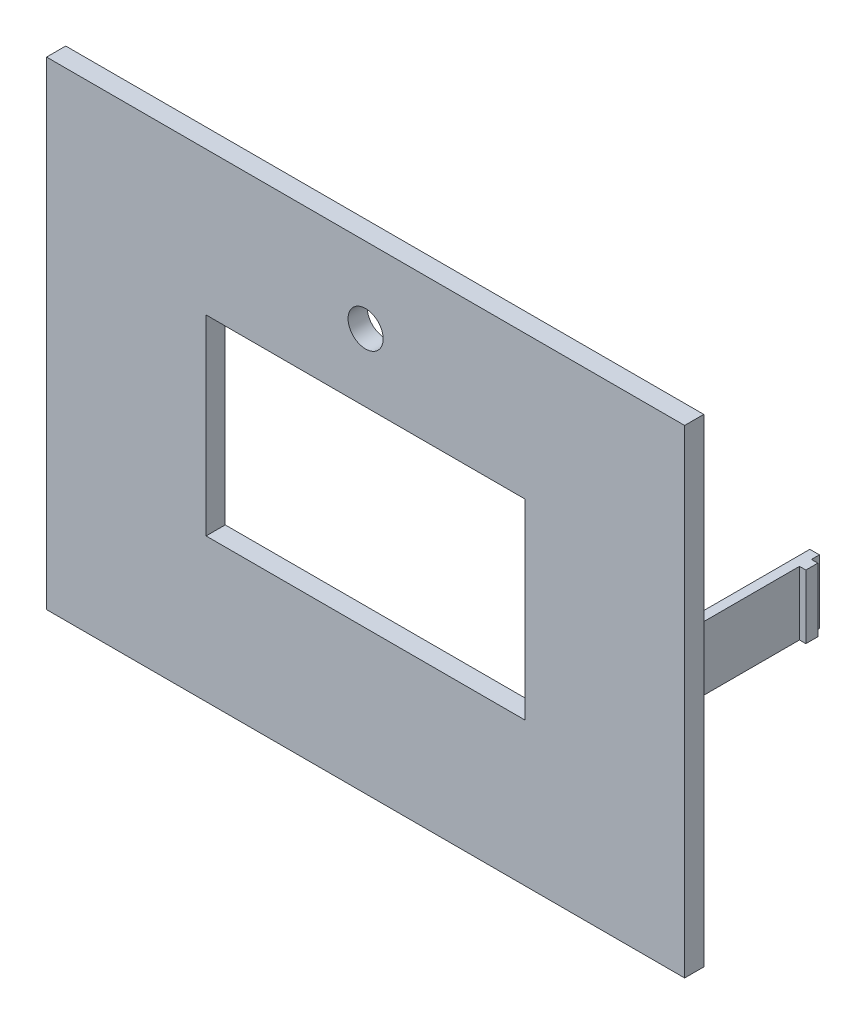
ISO-10303-21;
HEADER;
FILE_DESCRIPTION(('STEP AP214'),'2;1');
FILE_NAME('part.step','',(''),(''),'','','');
FILE_SCHEMA(('AUTOMOTIVE_DESIGN { 1 0 10303 214 1 1 1 1 }'));
ENDSEC;
DATA;
#1=APPLICATION_CONTEXT('core data for automotive mechanical design processes');
#2=APPLICATION_PROTOCOL_DEFINITION('international standard','automotive_design',2000,#1);
#3=PRODUCT_CONTEXT('',#1,'mechanical');
#4=PRODUCT('Part','Part','',(#3));
#5=PRODUCT_RELATED_PRODUCT_CATEGORY('part','',(#4));
#6=PRODUCT_DEFINITION_FORMATION('','',#4);
#7=PRODUCT_DEFINITION_CONTEXT('part definition',#1,'design');
#8=PRODUCT_DEFINITION('design','',#6,#7);
#9=PRODUCT_DEFINITION_SHAPE('','',#8);
#10=(LENGTH_UNIT() NAMED_UNIT(*) SI_UNIT(.MILLI.,.METRE.));
#11=(NAMED_UNIT(*) PLANE_ANGLE_UNIT() SI_UNIT($,.RADIAN.));
#12=(NAMED_UNIT(*) SI_UNIT($,.STERADIAN.) SOLID_ANGLE_UNIT());
#13=UNCERTAINTY_MEASURE_WITH_UNIT(LENGTH_MEASURE(1.E-05),#10,'distance_accuracy_value','');
#14=(GEOMETRIC_REPRESENTATION_CONTEXT(3) GLOBAL_UNCERTAINTY_ASSIGNED_CONTEXT((#13)) GLOBAL_UNIT_ASSIGNED_CONTEXT((#10,
#11,#12)) REPRESENTATION_CONTEXT('',''));
#15=CARTESIAN_POINT('',(0.,0.,0.));
#16=DIRECTION('',(0.,0.,1.));
#17=DIRECTION('',(1.,0.,0.));
#18=AXIS2_PLACEMENT_3D('',#15,#16,#17);
#19=CARTESIAN_POINT('',(36.5,-4.,0.));
#20=DIRECTION('',(-1.,0.,0.));
#21=DIRECTION('',(0.,0.,1.));
#22=AXIS2_PLACEMENT_3D('',#19,#20,#21);
#23=PLANE('',#22);
#24=DIRECTION('',(0.,-1.,0.));
#25=VECTOR('',#24,1.);
#26=CARTESIAN_POINT('',(36.5,-4.,-15.5));
#27=LINE('',#26,#25);
#28=CARTESIAN_POINT('',(36.5,4.,-15.5));
#29=VERTEX_POINT('',#28);
#30=CARTESIAN_POINT('',(36.5,-4.,-15.5));
#31=VERTEX_POINT('',#30);
#32=EDGE_CURVE('E221',#29,#31,#27,.T.);
#33=ORIENTED_EDGE('',*,*,#32,.F.);
#34=DIRECTION('',(0.,0.,-1.));
#35=VECTOR('',#34,1.);
#36=CARTESIAN_POINT('',(36.5,4.,0.));
#37=LINE('',#36,#35);
#38=CARTESIAN_POINT('',(36.5,4.,0.));
#39=VERTEX_POINT('',#38);
#40=EDGE_CURVE('E245',#39,#29,#37,.T.);
#41=ORIENTED_EDGE('',*,*,#40,.F.);
#42=DIRECTION('',(0.,1.,0.));
#43=VECTOR('',#42,1.);
#44=CARTESIAN_POINT('',(36.5,-4.,0.));
#45=LINE('',#44,#43);
#46=CARTESIAN_POINT('',(36.5,-4.,0.));
#47=VERTEX_POINT('',#46);
#48=EDGE_CURVE('E233',#47,#39,#45,.T.);
#49=ORIENTED_EDGE('',*,*,#48,.F.);
#50=DIRECTION('',(0.,0.,-1.));
#51=VECTOR('',#50,1.);
#52=CARTESIAN_POINT('',(36.5,-4.,0.));
#53=LINE('',#52,#51);
#54=EDGE_CURVE('E213',#47,#31,#53,.T.);
#55=ORIENTED_EDGE('',*,*,#54,.T.);
#56=EDGE_LOOP('',(#33,#41,#49,#55));
#57=FACE_BOUND('',#56,.T.);
#58=ADVANCED_FACE('F45',(#57),#23,.F.);
#59=CARTESIAN_POINT('',(-36.5,-4.,0.));
#60=DIRECTION('',(1.,0.,0.));
#61=DIRECTION('',(0.,0.,-1.));
#62=AXIS2_PLACEMENT_3D('',#59,#60,#61);
#63=PLANE('',#62);
#64=DIRECTION('',(0.,1.,0.));
#65=VECTOR('',#64,1.);
#66=CARTESIAN_POINT('',(-36.5,-4.,-15.5));
#67=LINE('',#66,#65);
#68=CARTESIAN_POINT('',(-36.5,-4.,-15.5));
#69=VERTEX_POINT('',#68);
#70=CARTESIAN_POINT('',(-36.5,4.,-15.5));
#71=VERTEX_POINT('',#70);
#72=EDGE_CURVE('E492',#69,#71,#67,.T.);
#73=ORIENTED_EDGE('',*,*,#72,.F.);
#74=DIRECTION('',(0.,0.,-1.));
#75=VECTOR('',#74,1.);
#76=CARTESIAN_POINT('',(-36.5,-4.,0.));
#77=LINE('',#76,#75);
#78=CARTESIAN_POINT('',(-36.5,-4.,0.));
#79=VERTEX_POINT('',#78);
#80=EDGE_CURVE('E289',#79,#69,#77,.T.);
#81=ORIENTED_EDGE('',*,*,#80,.F.);
#82=DIRECTION('',(0.,-1.,0.));
#83=VECTOR('',#82,1.);
#84=CARTESIAN_POINT('',(-36.5,-4.,0.));
#85=LINE('',#84,#83);
#86=CARTESIAN_POINT('',(-36.5,4.,0.));
#87=VERTEX_POINT('',#86);
#88=EDGE_CURVE('E249',#87,#79,#85,.T.);
#89=ORIENTED_EDGE('',*,*,#88,.F.);
#90=DIRECTION('',(0.,0.,-1.));
#91=VECTOR('',#90,1.);
#92=CARTESIAN_POINT('',(-36.5,4.,0.));
#93=LINE('',#92,#91);
#94=EDGE_CURVE('E278',#87,#71,#93,.T.);
#95=ORIENTED_EDGE('',*,*,#94,.T.);
#96=EDGE_LOOP('',(#73,#81,#89,#95));
#97=FACE_BOUND('',#96,.T.);
#98=ADVANCED_FACE('F402',(#97),#63,.F.);
#99=CARTESIAN_POINT('',(0.,0.,0.));
#100=DIRECTION('',(0.,0.,-1.));
#101=DIRECTION('',(-1.,0.,0.));
#102=AXIS2_PLACEMENT_3D('',#99,#100,#101);
#103=PLANE('',#102);
#104=CARTESIAN_POINT('',(0.,20.5,0.));
#105=DIRECTION('',(0.,0.,1.));
#106=DIRECTION('',(1.,0.,0.));
#107=AXIS2_PLACEMENT_3D('',#104,#105,#106);
#108=CIRCLE('',#107,2.2);
#109=CARTESIAN_POINT('',(2.2,20.5,0.));
#110=VERTEX_POINT('',#109);
#111=EDGE_CURVE('E524',#110,#110,#108,.T.);
#112=ORIENTED_EDGE('',*,*,#111,.T.);
#113=EDGE_LOOP('',(#112));
#114=FACE_BOUND('',#113,.T.);
#115=DIRECTION('',(0.,-1.,0.));
#116=VECTOR('',#115,1.);
#117=CARTESIAN_POINT('',(-40.,-30.,0.));
#118=LINE('',#117,#116);
#119=CARTESIAN_POINT('',(-40.,30.,0.));
#120=VERTEX_POINT('',#119);
#121=CARTESIAN_POINT('',(-40.,-30.,0.));
#122=VERTEX_POINT('',#121);
#123=EDGE_CURVE('E336',#120,#122,#118,.T.);
#124=ORIENTED_EDGE('',*,*,#123,.F.);
#125=DIRECTION('',(-1.,0.,0.));
#126=VECTOR('',#125,1.);
#127=CARTESIAN_POINT('',(-40.,30.,0.));
#128=LINE('',#127,#126);
#129=CARTESIAN_POINT('',(40.,30.,0.));
#130=VERTEX_POINT('',#129);
#131=EDGE_CURVE('E342',#130,#120,#128,.T.);
#132=ORIENTED_EDGE('',*,*,#131,.F.);
#133=DIRECTION('',(0.,1.,0.));
#134=VECTOR('',#133,1.);
#135=CARTESIAN_POINT('',(40.,-30.,0.));
#136=LINE('',#135,#134);
#137=CARTESIAN_POINT('',(40.,-30.,0.));
#138=VERTEX_POINT('',#137);
#139=EDGE_CURVE('E358',#138,#130,#136,.T.);
#140=ORIENTED_EDGE('',*,*,#139,.F.);
#141=DIRECTION('',(1.,0.,0.));
#142=VECTOR('',#141,1.);
#143=CARTESIAN_POINT('',(-40.,-30.,0.));
#144=LINE('',#143,#142);
#145=EDGE_CURVE('E355',#122,#138,#144,.T.);
#146=ORIENTED_EDGE('',*,*,#145,.F.);
#147=EDGE_LOOP('',(#124,#132,#140,#146));
#148=FACE_BOUND('',#147,.T.);
#149=DIRECTION('',(-1.,0.,0.));
#150=VECTOR('',#149,1.);
#151=CARTESIAN_POINT('',(-20.,12.,0.));
#152=LINE('',#151,#150);
#153=CARTESIAN_POINT('',(20.,12.,0.));
#154=VERTEX_POINT('',#153);
#155=CARTESIAN_POINT('',(-20.,12.,0.));
#156=VERTEX_POINT('',#155);
#157=EDGE_CURVE('E298',#154,#156,#152,.T.);
#158=ORIENTED_EDGE('',*,*,#157,.T.);
#159=DIRECTION('',(0.,-1.,0.));
#160=VECTOR('',#159,1.);
#161=CARTESIAN_POINT('',(-20.,-12.,0.));
#162=LINE('',#161,#160);
#163=CARTESIAN_POINT('',(-20.,-12.,0.));
#164=VERTEX_POINT('',#163);
#165=EDGE_CURVE('E293',#156,#164,#162,.T.);
#166=ORIENTED_EDGE('',*,*,#165,.T.);
#167=DIRECTION('',(1.,0.,0.));
#168=VECTOR('',#167,1.);
#169=CARTESIAN_POINT('',(-20.,-12.,0.));
#170=LINE('',#169,#168);
#171=CARTESIAN_POINT('',(20.,-12.,0.));
#172=VERTEX_POINT('',#171);
#173=EDGE_CURVE('E312',#164,#172,#170,.T.);
#174=ORIENTED_EDGE('',*,*,#173,.T.);
#175=DIRECTION('',(0.,1.,0.));
#176=VECTOR('',#175,1.);
#177=CARTESIAN_POINT('',(20.,-12.,0.));
#178=LINE('',#177,#176);
#179=EDGE_CURVE('E316',#172,#154,#178,.T.);
#180=ORIENTED_EDGE('',*,*,#179,.T.);
#181=EDGE_LOOP('',(#158,#166,#174,#180));
#182=FACE_BOUND('',#181,.T.);
#183=DIRECTION('',(-1.,0.,0.));
#184=VECTOR('',#183,1.);
#185=CARTESIAN_POINT('',(-36.5,4.,0.));
#186=LINE('',#185,#184);
#187=CARTESIAN_POINT('',(-35.3,4.,0.));
#188=VERTEX_POINT('',#187);
#189=EDGE_CURVE('E262',#188,#87,#186,.T.);
#190=ORIENTED_EDGE('',*,*,#189,.T.);
#191=ORIENTED_EDGE('',*,*,#88,.T.);
#192=DIRECTION('',(1.,0.,0.));
#193=VECTOR('',#192,1.);
#194=CARTESIAN_POINT('',(-36.5,-4.,0.));
#195=LINE('',#194,#193);
#196=CARTESIAN_POINT('',(-35.3,-4.,0.));
#197=VERTEX_POINT('',#196);
#198=EDGE_CURVE('E253',#79,#197,#195,.T.);
#199=ORIENTED_EDGE('',*,*,#198,.T.);
#200=DIRECTION('',(0.,1.,0.));
#201=VECTOR('',#200,1.);
#202=CARTESIAN_POINT('',(-35.3,-4.,0.));
#203=LINE('',#202,#201);
#204=EDGE_CURVE('E258',#197,#188,#203,.T.);
#205=ORIENTED_EDGE('',*,*,#204,.T.);
#206=EDGE_LOOP('',(#190,#191,#199,#205));
#207=FACE_BOUND('',#206,.T.);
#208=DIRECTION('',(-1.,0.,0.));
#209=VECTOR('',#208,1.);
#210=CARTESIAN_POINT('',(35.3,4.,0.));
#211=LINE('',#210,#209);
#212=CARTESIAN_POINT('',(35.3,4.,0.));
#213=VERTEX_POINT('',#212);
#214=EDGE_CURVE('E437',#39,#213,#211,.T.);
#215=ORIENTED_EDGE('',*,*,#214,.T.);
#216=DIRECTION('',(0.,-1.,0.));
#217=VECTOR('',#216,1.);
#218=CARTESIAN_POINT('',(35.3,-4.,0.));
#219=LINE('',#218,#217);
#220=CARTESIAN_POINT('',(35.3,-4.,0.));
#221=VERTEX_POINT('',#220);
#222=EDGE_CURVE('E450',#213,#221,#219,.T.);
#223=ORIENTED_EDGE('',*,*,#222,.T.);
#224=DIRECTION('',(1.,0.,0.));
#225=VECTOR('',#224,1.);
#226=CARTESIAN_POINT('',(35.3,-4.,0.));
#227=LINE('',#226,#225);
#228=EDGE_CURVE('E462',#221,#47,#227,.T.);
#229=ORIENTED_EDGE('',*,*,#228,.T.);
#230=ORIENTED_EDGE('',*,*,#48,.T.);
#231=EDGE_LOOP('',(#215,#223,#229,#230));
#232=FACE_BOUND('',#231,.T.);
#233=ADVANCED_FACE('F382',(#114,#148,#182,#207,#232),#103,.T.);
#234=CARTESIAN_POINT('',(0.,0.,2.4));
#235=DIRECTION('',(0.,0.,-1.));
#236=DIRECTION('',(-1.,0.,0.));
#237=AXIS2_PLACEMENT_3D('',#234,#235,#236);
#238=PLANE('',#237);
#239=CARTESIAN_POINT('',(0.,20.5,2.4));
#240=DIRECTION('',(0.,0.,1.));
#241=DIRECTION('',(1.,0.,0.));
#242=AXIS2_PLACEMENT_3D('',#239,#240,#241);
#243=CIRCLE('',#242,2.2);
#244=CARTESIAN_POINT('',(2.2,20.5,2.4));
#245=VERTEX_POINT('',#244);
#246=EDGE_CURVE('E519',#245,#245,#243,.T.);
#247=ORIENTED_EDGE('',*,*,#246,.F.);
#248=EDGE_LOOP('',(#247));
#249=FACE_BOUND('',#248,.T.);
#250=DIRECTION('',(0.,-1.,0.));
#251=VECTOR('',#250,1.);
#252=CARTESIAN_POINT('',(-40.,-30.,2.4));
#253=LINE('',#252,#251);
#254=CARTESIAN_POINT('',(-40.,30.,2.4));
#255=VERTEX_POINT('',#254);
#256=CARTESIAN_POINT('',(-40.,-30.,2.4));
#257=VERTEX_POINT('',#256);
#258=EDGE_CURVE('E337',#255,#257,#253,.T.);
#259=ORIENTED_EDGE('',*,*,#258,.T.);
#260=DIRECTION('',(1.,0.,0.));
#261=VECTOR('',#260,1.);
#262=CARTESIAN_POINT('',(-40.,-30.,2.4));
#263=LINE('',#262,#261);
#264=CARTESIAN_POINT('',(40.,-30.,2.4));
#265=VERTEX_POINT('',#264);
#266=EDGE_CURVE('E341',#257,#265,#263,.T.);
#267=ORIENTED_EDGE('',*,*,#266,.T.);
#268=DIRECTION('',(0.,1.,0.));
#269=VECTOR('',#268,1.);
#270=CARTESIAN_POINT('',(40.,-30.,2.4));
#271=LINE('',#270,#269);
#272=CARTESIAN_POINT('',(40.,30.,2.4));
#273=VERTEX_POINT('',#272);
#274=EDGE_CURVE('E345',#265,#273,#271,.T.);
#275=ORIENTED_EDGE('',*,*,#274,.T.);
#276=DIRECTION('',(-1.,0.,0.));
#277=VECTOR('',#276,1.);
#278=CARTESIAN_POINT('',(-40.,30.,2.4));
#279=LINE('',#278,#277);
#280=EDGE_CURVE('E348',#273,#255,#279,.T.);
#281=ORIENTED_EDGE('',*,*,#280,.T.);
#282=EDGE_LOOP('',(#259,#267,#275,#281));
#283=FACE_BOUND('',#282,.T.);
#284=DIRECTION('',(0.,-1.,0.));
#285=VECTOR('',#284,1.);
#286=CARTESIAN_POINT('',(-20.,-12.,2.4));
#287=LINE('',#286,#285);
#288=CARTESIAN_POINT('',(-20.,12.,2.4));
#289=VERTEX_POINT('',#288);
#290=CARTESIAN_POINT('',(-20.,-12.,2.4));
#291=VERTEX_POINT('',#290);
#292=EDGE_CURVE('E294',#289,#291,#287,.T.);
#293=ORIENTED_EDGE('',*,*,#292,.F.);
#294=DIRECTION('',(-1.,0.,0.));
#295=VECTOR('',#294,1.);
#296=CARTESIAN_POINT('',(-20.,12.,2.4));
#297=LINE('',#296,#295);
#298=CARTESIAN_POINT('',(20.,12.,2.4));
#299=VERTEX_POINT('',#298);
#300=EDGE_CURVE('E305',#299,#289,#297,.T.);
#301=ORIENTED_EDGE('',*,*,#300,.F.);
#302=DIRECTION('',(0.,1.,0.));
#303=VECTOR('',#302,1.);
#304=CARTESIAN_POINT('',(20.,-12.,2.4));
#305=LINE('',#304,#303);
#306=CARTESIAN_POINT('',(20.,-12.,2.4));
#307=VERTEX_POINT('',#306);
#308=EDGE_CURVE('E301',#307,#299,#305,.T.);
#309=ORIENTED_EDGE('',*,*,#308,.F.);
#310=DIRECTION('',(1.,0.,0.));
#311=VECTOR('',#310,1.);
#312=CARTESIAN_POINT('',(-20.,-12.,2.4));
#313=LINE('',#312,#311);
#314=EDGE_CURVE('E297',#291,#307,#313,.T.);
#315=ORIENTED_EDGE('',*,*,#314,.F.);
#316=EDGE_LOOP('',(#293,#301,#309,#315));
#317=FACE_BOUND('',#316,.T.);
#318=ADVANCED_FACE('F392',(#249,#283,#317),#238,.F.);
#319=CARTESIAN_POINT('',(-40.,-30.,2.4));
#320=DIRECTION('',(1.,0.,0.));
#321=DIRECTION('',(0.,0.,-1.));
#322=AXIS2_PLACEMENT_3D('',#319,#320,#321);
#323=PLANE('',#322);
#324=ORIENTED_EDGE('',*,*,#123,.T.);
#325=DIRECTION('',(0.,0.,-1.));
#326=VECTOR('',#325,1.);
#327=CARTESIAN_POINT('',(-40.,-30.,2.4));
#328=LINE('',#327,#326);
#329=EDGE_CURVE('E11',#257,#122,#328,.T.);
#330=ORIENTED_EDGE('',*,*,#329,.F.);
#331=ORIENTED_EDGE('',*,*,#258,.F.);
#332=DIRECTION('',(0.,0.,-1.));
#333=VECTOR('',#332,1.);
#334=CARTESIAN_POINT('',(-40.,30.,2.4));
#335=LINE('',#334,#333);
#336=EDGE_CURVE('E351',#255,#120,#335,.T.);
#337=ORIENTED_EDGE('',*,*,#336,.T.);
#338=EDGE_LOOP('',(#324,#330,#331,#337));
#339=FACE_BOUND('',#338,.T.);
#340=ADVANCED_FACE('F47',(#339),#323,.F.);
#341=CARTESIAN_POINT('',(-40.,-30.,2.4));
#342=DIRECTION('',(0.,1.,0.));
#343=DIRECTION('',(0.,0.,1.));
#344=AXIS2_PLACEMENT_3D('',#341,#342,#343);
#345=PLANE('',#344);
#346=ORIENTED_EDGE('',*,*,#145,.T.);
#347=DIRECTION('',(0.,0.,-1.));
#348=VECTOR('',#347,1.);
#349=CARTESIAN_POINT('',(40.,-30.,2.4));
#350=LINE('',#349,#348);
#351=EDGE_CURVE('E54',#265,#138,#350,.T.);
#352=ORIENTED_EDGE('',*,*,#351,.F.);
#353=ORIENTED_EDGE('',*,*,#266,.F.);
#354=ORIENTED_EDGE('',*,*,#329,.T.);
#355=EDGE_LOOP('',(#346,#352,#353,#354));
#356=FACE_BOUND('',#355,.T.);
#357=ADVANCED_FACE('F394',(#356),#345,.F.);
#358=CARTESIAN_POINT('',(40.,-30.,2.4));
#359=DIRECTION('',(-1.,0.,0.));
#360=DIRECTION('',(0.,0.,1.));
#361=AXIS2_PLACEMENT_3D('',#358,#359,#360);
#362=PLANE('',#361);
#363=ORIENTED_EDGE('',*,*,#139,.T.);
#364=DIRECTION('',(0.,0.,-1.));
#365=VECTOR('',#364,1.);
#366=CARTESIAN_POINT('',(40.,30.,2.4));
#367=LINE('',#366,#365);
#368=EDGE_CURVE('E366',#273,#130,#367,.T.);
#369=ORIENTED_EDGE('',*,*,#368,.F.);
#370=ORIENTED_EDGE('',*,*,#274,.F.);
#371=ORIENTED_EDGE('',*,*,#351,.T.);
#372=EDGE_LOOP('',(#363,#369,#370,#371));
#373=FACE_BOUND('',#372,.T.);
#374=ADVANCED_FACE('F376',(#373),#362,.F.);
#375=CARTESIAN_POINT('',(-40.,30.,2.4));
#376=DIRECTION('',(0.,-1.,0.));
#377=DIRECTION('',(0.,0.,-1.));
#378=AXIS2_PLACEMENT_3D('',#375,#376,#377);
#379=PLANE('',#378);
#380=ORIENTED_EDGE('',*,*,#131,.T.);
#381=ORIENTED_EDGE('',*,*,#336,.F.);
#382=ORIENTED_EDGE('',*,*,#280,.F.);
#383=ORIENTED_EDGE('',*,*,#368,.T.);
#384=EDGE_LOOP('',(#380,#381,#382,#383));
#385=FACE_BOUND('',#384,.T.);
#386=ADVANCED_FACE('F386',(#385),#379,.F.);
#387=CARTESIAN_POINT('',(-20.,-12.,2.4));
#388=DIRECTION('',(1.,0.,0.));
#389=DIRECTION('',(0.,0.,-1.));
#390=AXIS2_PLACEMENT_3D('',#387,#388,#389);
#391=PLANE('',#390);
#392=ORIENTED_EDGE('',*,*,#165,.F.);
#393=DIRECTION('',(0.,0.,-1.));
#394=VECTOR('',#393,1.);
#395=CARTESIAN_POINT('',(-20.,12.,2.4));
#396=LINE('',#395,#394);
#397=EDGE_CURVE('E308',#289,#156,#396,.T.);
#398=ORIENTED_EDGE('',*,*,#397,.F.);
#399=ORIENTED_EDGE('',*,*,#292,.T.);
#400=DIRECTION('',(0.,0.,-1.));
#401=VECTOR('',#400,1.);
#402=CARTESIAN_POINT('',(-20.,-12.,2.4));
#403=LINE('',#402,#401);
#404=EDGE_CURVE('E332',#291,#164,#403,.T.);
#405=ORIENTED_EDGE('',*,*,#404,.T.);
#406=EDGE_LOOP('',(#392,#398,#399,#405));
#407=FACE_BOUND('',#406,.T.);
#408=ADVANCED_FACE('F545',(#407),#391,.T.);
#409=CARTESIAN_POINT('',(-20.,-12.,2.4));
#410=DIRECTION('',(0.,1.,0.));
#411=DIRECTION('',(0.,0.,1.));
#412=AXIS2_PLACEMENT_3D('',#409,#410,#411);
#413=PLANE('',#412);
#414=ORIENTED_EDGE('',*,*,#173,.F.);
#415=ORIENTED_EDGE('',*,*,#404,.F.);
#416=ORIENTED_EDGE('',*,*,#314,.T.);
#417=DIRECTION('',(0.,0.,-1.));
#418=VECTOR('',#417,1.);
#419=CARTESIAN_POINT('',(20.,-12.,2.4));
#420=LINE('',#419,#418);
#421=EDGE_CURVE('E329',#307,#172,#420,.T.);
#422=ORIENTED_EDGE('',*,*,#421,.T.);
#423=EDGE_LOOP('',(#414,#415,#416,#422));
#424=FACE_BOUND('',#423,.T.);
#425=ADVANCED_FACE('F552',(#424),#413,.T.);
#426=CARTESIAN_POINT('',(20.,-12.,2.4));
#427=DIRECTION('',(-1.,0.,0.));
#428=DIRECTION('',(0.,0.,1.));
#429=AXIS2_PLACEMENT_3D('',#426,#427,#428);
#430=PLANE('',#429);
#431=ORIENTED_EDGE('',*,*,#179,.F.);
#432=ORIENTED_EDGE('',*,*,#421,.F.);
#433=ORIENTED_EDGE('',*,*,#308,.T.);
#434=DIRECTION('',(0.,0.,-1.));
#435=VECTOR('',#434,1.);
#436=CARTESIAN_POINT('',(20.,12.,2.4));
#437=LINE('',#436,#435);
#438=EDGE_CURVE('E326',#299,#154,#437,.T.);
#439=ORIENTED_EDGE('',*,*,#438,.T.);
#440=EDGE_LOOP('',(#431,#432,#433,#439));
#441=FACE_BOUND('',#440,.T.);
#442=ADVANCED_FACE('F557',(#441),#430,.T.);
#443=CARTESIAN_POINT('',(-20.,12.,2.4));
#444=DIRECTION('',(0.,-1.,0.));
#445=DIRECTION('',(0.,0.,-1.));
#446=AXIS2_PLACEMENT_3D('',#443,#444,#445);
#447=PLANE('',#446);
#448=ORIENTED_EDGE('',*,*,#157,.F.);
#449=ORIENTED_EDGE('',*,*,#438,.F.);
#450=ORIENTED_EDGE('',*,*,#300,.T.);
#451=ORIENTED_EDGE('',*,*,#397,.T.);
#452=EDGE_LOOP('',(#448,#449,#450,#451));
#453=FACE_BOUND('',#452,.T.);
#454=ADVANCED_FACE('F564',(#453),#447,.T.);
#455=CARTESIAN_POINT('',(-36.5,-4.,-17.));
#456=VERTEX_POINT('',#455);
#457=CARTESIAN_POINT('',(-36.5,-4.,-18.));
#458=VERTEX_POINT('',#457);
#459=EDGE_CURVE('E69',#456,#458,#77,.T.);
#460=ORIENTED_EDGE('',*,*,#459,.F.);
#461=DIRECTION('',(0.,1.,0.));
#462=VECTOR('',#461,1.);
#463=CARTESIAN_POINT('',(-36.5,-4.,-17.));
#464=LINE('',#463,#462);
#465=CARTESIAN_POINT('',(-36.5,4.,-17.));
#466=VERTEX_POINT('',#465);
#467=EDGE_CURVE('E480',#456,#466,#464,.T.);
#468=ORIENTED_EDGE('',*,*,#467,.T.);
#469=CARTESIAN_POINT('',(-36.5,4.,-18.));
#470=VERTEX_POINT('',#469);
#471=EDGE_CURVE('E266',#466,#470,#93,.T.);
#472=ORIENTED_EDGE('',*,*,#471,.T.);
#473=DIRECTION('',(0.,-1.,0.));
#474=VECTOR('',#473,1.);
#475=CARTESIAN_POINT('',(-36.5,-4.,-18.));
#476=LINE('',#475,#474);
#477=EDGE_CURVE('E243',#470,#458,#476,.T.);
#478=ORIENTED_EDGE('',*,*,#477,.T.);
#479=EDGE_LOOP('',(#460,#468,#472,#478));
#480=FACE_BOUND('',#479,.T.);
#481=ADVANCED_FACE('F412',(#480),#63,.F.);
#482=CARTESIAN_POINT('',(-36.5,-4.,0.));
#483=DIRECTION('',(0.,1.,0.));
#484=DIRECTION('',(0.,0.,1.));
#485=AXIS2_PLACEMENT_3D('',#482,#483,#484);
#486=PLANE('',#485);
#487=DIRECTION('',(1.,0.,0.));
#488=VECTOR('',#487,1.);
#489=CARTESIAN_POINT('',(-36.5,-4.,-18.));
#490=LINE('',#489,#488);
#491=CARTESIAN_POINT('',(-35.3,-4.,-18.));
#492=VERTEX_POINT('',#491);
#493=EDGE_CURVE('E269',#458,#492,#490,.T.);
#494=ORIENTED_EDGE('',*,*,#493,.T.);
#495=DIRECTION('',(0.,0.,-1.));
#496=VECTOR('',#495,1.);
#497=CARTESIAN_POINT('',(-35.3,-4.,0.));
#498=LINE('',#497,#496);
#499=EDGE_CURVE('E285',#197,#492,#498,.T.);
#500=ORIENTED_EDGE('',*,*,#499,.F.);
#501=ORIENTED_EDGE('',*,*,#198,.F.);
#502=ORIENTED_EDGE('',*,*,#80,.T.);
#503=DIRECTION('',(1.,0.,0.));
#504=VECTOR('',#503,1.);
#505=CARTESIAN_POINT('',(-37.3,-4.,-15.5));
#506=LINE('',#505,#504);
#507=CARTESIAN_POINT('',(-37.3,-4.,-15.5));
#508=VERTEX_POINT('',#507);
#509=EDGE_CURVE('E496',#508,#69,#506,.T.);
#510=ORIENTED_EDGE('',*,*,#509,.F.);
#511=DIRECTION('',(0.,0.,-1.));
#512=VECTOR('',#511,1.);
#513=CARTESIAN_POINT('',(-37.3,-4.,-15.5));
#514=LINE('',#513,#512);
#515=CARTESIAN_POINT('',(-37.3,-4.,-17.));
#516=VERTEX_POINT('',#515);
#517=EDGE_CURVE('E458',#508,#516,#514,.T.);
#518=ORIENTED_EDGE('',*,*,#517,.T.);
#519=DIRECTION('',(1.,0.,0.));
#520=VECTOR('',#519,1.);
#521=CARTESIAN_POINT('',(-37.3,-4.,-17.));
#522=LINE('',#521,#520);
#523=EDGE_CURVE('E483',#516,#456,#522,.T.);
#524=ORIENTED_EDGE('',*,*,#523,.T.);
#525=ORIENTED_EDGE('',*,*,#459,.T.);
#526=EDGE_LOOP('',(#494,#500,#501,#502,#510,#518,#524,#525));
#527=FACE_BOUND('',#526,.T.);
#528=ADVANCED_FACE('F580',(#527),#486,.F.);
#529=CARTESIAN_POINT('',(-35.3,-4.,0.));
#530=DIRECTION('',(-1.,0.,0.));
#531=DIRECTION('',(0.,0.,1.));
#532=AXIS2_PLACEMENT_3D('',#529,#530,#531);
#533=PLANE('',#532);
#534=DIRECTION('',(0.,1.,0.));
#535=VECTOR('',#534,1.);
#536=CARTESIAN_POINT('',(-35.3,-4.,-18.));
#537=LINE('',#536,#535);
#538=CARTESIAN_POINT('',(-35.3,4.,-18.));
#539=VERTEX_POINT('',#538);
#540=EDGE_CURVE('E272',#492,#539,#537,.T.);
#541=ORIENTED_EDGE('',*,*,#540,.T.);
#542=DIRECTION('',(0.,0.,-1.));
#543=VECTOR('',#542,1.);
#544=CARTESIAN_POINT('',(-35.3,4.,0.));
#545=LINE('',#544,#543);
#546=EDGE_CURVE('E281',#188,#539,#545,.T.);
#547=ORIENTED_EDGE('',*,*,#546,.F.);
#548=ORIENTED_EDGE('',*,*,#204,.F.);
#549=ORIENTED_EDGE('',*,*,#499,.T.);
#550=EDGE_LOOP('',(#541,#547,#548,#549));
#551=FACE_BOUND('',#550,.T.);
#552=ADVANCED_FACE('F583',(#551),#533,.F.);
#553=CARTESIAN_POINT('',(-36.5,4.,0.));
#554=DIRECTION('',(0.,-1.,0.));
#555=DIRECTION('',(0.,0.,-1.));
#556=AXIS2_PLACEMENT_3D('',#553,#554,#555);
#557=PLANE('',#556);
#558=DIRECTION('',(-1.,0.,0.));
#559=VECTOR('',#558,1.);
#560=CARTESIAN_POINT('',(-36.5,4.,-18.));
#561=LINE('',#560,#559);
#562=EDGE_CURVE('E254',#539,#470,#561,.T.);
#563=ORIENTED_EDGE('',*,*,#562,.T.);
#564=ORIENTED_EDGE('',*,*,#471,.F.);
#565=DIRECTION('',(-1.,0.,0.));
#566=VECTOR('',#565,1.);
#567=CARTESIAN_POINT('',(-37.3,4.,-17.));
#568=LINE('',#567,#566);
#569=CARTESIAN_POINT('',(-37.3,4.,-17.));
#570=VERTEX_POINT('',#569);
#571=EDGE_CURVE('E476',#466,#570,#568,.T.);
#572=ORIENTED_EDGE('',*,*,#571,.T.);
#573=DIRECTION('',(0.,0.,-1.));
#574=VECTOR('',#573,1.);
#575=CARTESIAN_POINT('',(-37.3,4.,-15.5));
#576=LINE('',#575,#574);
#577=CARTESIAN_POINT('',(-37.3,4.,-15.5));
#578=VERTEX_POINT('',#577);
#579=EDGE_CURVE('E471',#578,#570,#576,.T.);
#580=ORIENTED_EDGE('',*,*,#579,.F.);
#581=DIRECTION('',(-1.,0.,0.));
#582=VECTOR('',#581,1.);
#583=CARTESIAN_POINT('',(-37.3,4.,-15.5));
#584=LINE('',#583,#582);
#585=EDGE_CURVE('E475',#71,#578,#584,.T.);
#586=ORIENTED_EDGE('',*,*,#585,.F.);
#587=ORIENTED_EDGE('',*,*,#94,.F.);
#588=ORIENTED_EDGE('',*,*,#189,.F.);
#589=ORIENTED_EDGE('',*,*,#546,.T.);
#590=EDGE_LOOP('',(#563,#564,#572,#580,#586,#587,#588,#589));
#591=FACE_BOUND('',#590,.T.);
#592=ADVANCED_FACE('F587',(#591),#557,.F.);
#593=CARTESIAN_POINT('',(0.,0.,-18.));
#594=DIRECTION('',(0.,0.,-1.));
#595=DIRECTION('',(-1.,0.,0.));
#596=AXIS2_PLACEMENT_3D('',#593,#594,#595);
#597=PLANE('',#596);
#598=ORIENTED_EDGE('',*,*,#477,.F.);
#599=ORIENTED_EDGE('',*,*,#562,.F.);
#600=ORIENTED_EDGE('',*,*,#540,.F.);
#601=ORIENTED_EDGE('',*,*,#493,.F.);
#602=EDGE_LOOP('',(#598,#599,#600,#601));
#603=FACE_BOUND('',#602,.T.);
#604=ADVANCED_FACE('F591',(#603),#597,.T.);
#605=CARTESIAN_POINT('',(35.3,-4.,0.));
#606=DIRECTION('',(1.,0.,0.));
#607=DIRECTION('',(0.,0.,-1.));
#608=AXIS2_PLACEMENT_3D('',#605,#606,#607);
#609=PLANE('',#608);
#610=DIRECTION('',(0.,-1.,0.));
#611=VECTOR('',#610,1.);
#612=CARTESIAN_POINT('',(35.3,-4.,-18.));
#613=LINE('',#612,#611);
#614=CARTESIAN_POINT('',(35.3,4.,-18.));
#615=VERTEX_POINT('',#614);
#616=CARTESIAN_POINT('',(35.3,-4.,-18.));
#617=VERTEX_POINT('',#616);
#618=EDGE_CURVE('E456',#615,#617,#613,.T.);
#619=ORIENTED_EDGE('',*,*,#618,.T.);
#620=DIRECTION('',(0.,0.,-1.));
#621=VECTOR('',#620,1.);
#622=CARTESIAN_POINT('',(35.3,-4.,0.));
#623=LINE('',#622,#621);
#624=EDGE_CURVE('E236',#221,#617,#623,.T.);
#625=ORIENTED_EDGE('',*,*,#624,.F.);
#626=ORIENTED_EDGE('',*,*,#222,.F.);
#627=DIRECTION('',(0.,0.,-1.));
#628=VECTOR('',#627,1.);
#629=CARTESIAN_POINT('',(35.3,4.,0.));
#630=LINE('',#629,#628);
#631=EDGE_CURVE('E432',#213,#615,#630,.T.);
#632=ORIENTED_EDGE('',*,*,#631,.T.);
#633=EDGE_LOOP('',(#619,#625,#626,#632));
#634=FACE_BOUND('',#633,.T.);
#635=ADVANCED_FACE('F423',(#634),#609,.F.);
#636=CARTESIAN_POINT('',(35.3,-4.,0.));
#637=DIRECTION('',(0.,1.,0.));
#638=DIRECTION('',(0.,0.,1.));
#639=AXIS2_PLACEMENT_3D('',#636,#637,#638);
#640=PLANE('',#639);
#641=DIRECTION('',(1.,0.,0.));
#642=VECTOR('',#641,1.);
#643=CARTESIAN_POINT('',(35.3,-4.,-18.));
#644=LINE('',#643,#642);
#645=CARTESIAN_POINT('',(36.5,-4.,-18.));
#646=VERTEX_POINT('',#645);
#647=EDGE_CURVE('E453',#617,#646,#644,.T.);
#648=ORIENTED_EDGE('',*,*,#647,.T.);
#649=CARTESIAN_POINT('',(36.5,-4.,-17.));
#650=VERTEX_POINT('',#649);
#651=EDGE_CURVE('E237',#650,#646,#53,.T.);
#652=ORIENTED_EDGE('',*,*,#651,.F.);
#653=DIRECTION('',(1.,0.,0.));
#654=VECTOR('',#653,1.);
#655=CARTESIAN_POINT('',(36.5,-4.,-17.));
#656=LINE('',#655,#654);
#657=CARTESIAN_POINT('',(37.3,-4.,-17.));
#658=VERTEX_POINT('',#657);
#659=EDGE_CURVE('E514',#650,#658,#656,.T.);
#660=ORIENTED_EDGE('',*,*,#659,.T.);
#661=DIRECTION('',(0.,0.,-1.));
#662=VECTOR('',#661,1.);
#663=CARTESIAN_POINT('',(37.3,-4.,-15.5));
#664=LINE('',#663,#662);
#665=CARTESIAN_POINT('',(37.3,-4.,-15.5));
#666=VERTEX_POINT('',#665);
#667=EDGE_CURVE('E216',#666,#658,#664,.T.);
#668=ORIENTED_EDGE('',*,*,#667,.F.);
#669=DIRECTION('',(1.,0.,0.));
#670=VECTOR('',#669,1.);
#671=CARTESIAN_POINT('',(36.5,-4.,-15.5));
#672=LINE('',#671,#670);
#673=EDGE_CURVE('E208',#31,#666,#672,.T.);
#674=ORIENTED_EDGE('',*,*,#673,.F.);
#675=ORIENTED_EDGE('',*,*,#54,.F.);
#676=ORIENTED_EDGE('',*,*,#228,.F.);
#677=ORIENTED_EDGE('',*,*,#624,.T.);
#678=EDGE_LOOP('',(#648,#652,#660,#668,#674,#675,#676,#677));
#679=FACE_BOUND('',#678,.T.);
#680=ADVANCED_FACE('F211',(#679),#640,.F.);
#681=CARTESIAN_POINT('',(36.5,4.,-17.));
#682=VERTEX_POINT('',#681);
#683=CARTESIAN_POINT('',(36.5,4.,-18.));
#684=VERTEX_POINT('',#683);
#685=EDGE_CURVE('E426',#682,#684,#37,.T.);
#686=ORIENTED_EDGE('',*,*,#685,.F.);
#687=DIRECTION('',(0.,-1.,0.));
#688=VECTOR('',#687,1.);
#689=CARTESIAN_POINT('',(36.5,-4.,-17.));
#690=LINE('',#689,#688);
#691=EDGE_CURVE('E61',#682,#650,#690,.T.);
#692=ORIENTED_EDGE('',*,*,#691,.T.);
#693=ORIENTED_EDGE('',*,*,#651,.T.);
#694=DIRECTION('',(0.,1.,0.));
#695=VECTOR('',#694,1.);
#696=CARTESIAN_POINT('',(36.5,-4.,-18.));
#697=LINE('',#696,#695);
#698=EDGE_CURVE('E429',#646,#684,#697,.T.);
#699=ORIENTED_EDGE('',*,*,#698,.T.);
#700=EDGE_LOOP('',(#686,#692,#693,#699));
#701=FACE_BOUND('',#700,.T.);
#702=ADVANCED_FACE('F404',(#701),#23,.F.);
#703=CARTESIAN_POINT('',(35.3,4.,0.));
#704=DIRECTION('',(0.,-1.,0.));
#705=DIRECTION('',(0.,0.,-1.));
#706=AXIS2_PLACEMENT_3D('',#703,#704,#705);
#707=PLANE('',#706);
#708=DIRECTION('',(-1.,0.,0.));
#709=VECTOR('',#708,1.);
#710=CARTESIAN_POINT('',(35.3,4.,-18.));
#711=LINE('',#710,#709);
#712=EDGE_CURVE('E447',#684,#615,#711,.T.);
#713=ORIENTED_EDGE('',*,*,#712,.T.);
#714=ORIENTED_EDGE('',*,*,#631,.F.);
#715=ORIENTED_EDGE('',*,*,#214,.F.);
#716=ORIENTED_EDGE('',*,*,#40,.T.);
#717=DIRECTION('',(-1.,0.,0.));
#718=VECTOR('',#717,1.);
#719=CARTESIAN_POINT('',(36.5,4.,-15.5));
#720=LINE('',#719,#718);
#721=CARTESIAN_POINT('',(37.3,4.,-15.5));
#722=VERTEX_POINT('',#721);
#723=EDGE_CURVE('E226',#722,#29,#720,.T.);
#724=ORIENTED_EDGE('',*,*,#723,.F.);
#725=DIRECTION('',(0.,0.,-1.));
#726=VECTOR('',#725,1.);
#727=CARTESIAN_POINT('',(37.3,4.,-15.5));
#728=LINE('',#727,#726);
#729=CARTESIAN_POINT('',(37.3,4.,-17.));
#730=VERTEX_POINT('',#729);
#731=EDGE_CURVE('E505',#722,#730,#728,.T.);
#732=ORIENTED_EDGE('',*,*,#731,.T.);
#733=DIRECTION('',(-1.,0.,0.));
#734=VECTOR('',#733,1.);
#735=CARTESIAN_POINT('',(36.5,4.,-17.));
#736=LINE('',#735,#734);
#737=EDGE_CURVE('E230',#730,#682,#736,.T.);
#738=ORIENTED_EDGE('',*,*,#737,.T.);
#739=ORIENTED_EDGE('',*,*,#685,.T.);
#740=EDGE_LOOP('',(#713,#714,#715,#716,#724,#732,#738,#739));
#741=FACE_BOUND('',#740,.T.);
#742=ADVANCED_FACE('F416',(#741),#707,.F.);
#743=CARTESIAN_POINT('',(0.,0.,-18.));
#744=DIRECTION('',(0.,0.,-1.));
#745=DIRECTION('',(-1.,0.,0.));
#746=AXIS2_PLACEMENT_3D('',#743,#744,#745);
#747=PLANE('',#746);
#748=ORIENTED_EDGE('',*,*,#618,.F.);
#749=ORIENTED_EDGE('',*,*,#712,.F.);
#750=ORIENTED_EDGE('',*,*,#698,.F.);
#751=ORIENTED_EDGE('',*,*,#647,.F.);
#752=EDGE_LOOP('',(#748,#749,#750,#751));
#753=FACE_BOUND('',#752,.T.);
#754=ADVANCED_FACE('F421',(#753),#747,.T.);
#755=CARTESIAN_POINT('',(-37.3,-4.,-15.5));
#756=DIRECTION('',(1.,0.,0.));
#757=DIRECTION('',(0.,0.,-1.));
#758=AXIS2_PLACEMENT_3D('',#755,#756,#757);
#759=PLANE('',#758);
#760=DIRECTION('',(0.,-1.,0.));
#761=VECTOR('',#760,1.);
#762=CARTESIAN_POINT('',(-37.3,-4.,-17.));
#763=LINE('',#762,#761);
#764=EDGE_CURVE('E486',#570,#516,#763,.T.);
#765=ORIENTED_EDGE('',*,*,#764,.T.);
#766=ORIENTED_EDGE('',*,*,#517,.F.);
#767=DIRECTION('',(0.,-1.,0.));
#768=VECTOR('',#767,1.);
#769=CARTESIAN_POINT('',(-37.3,-4.,-15.5));
#770=LINE('',#769,#768);
#771=EDGE_CURVE('E479',#578,#508,#770,.T.);
#772=ORIENTED_EDGE('',*,*,#771,.F.);
#773=ORIENTED_EDGE('',*,*,#579,.T.);
#774=EDGE_LOOP('',(#765,#766,#772,#773));
#775=FACE_BOUND('',#774,.T.);
#776=ADVANCED_FACE('F622',(#775),#759,.F.);
#777=CARTESIAN_POINT('',(0.,0.,-15.5));
#778=DIRECTION('',(0.,0.,-1.));
#779=DIRECTION('',(-1.,0.,0.));
#780=AXIS2_PLACEMENT_3D('',#777,#778,#779);
#781=PLANE('',#780);
#782=ORIENTED_EDGE('',*,*,#771,.T.);
#783=ORIENTED_EDGE('',*,*,#509,.T.);
#784=ORIENTED_EDGE('',*,*,#72,.T.);
#785=ORIENTED_EDGE('',*,*,#585,.T.);
#786=EDGE_LOOP('',(#782,#783,#784,#785));
#787=FACE_BOUND('',#786,.T.);
#788=ADVANCED_FACE('F616',(#787),#781,.F.);
#789=CARTESIAN_POINT('',(0.,0.,-17.));
#790=DIRECTION('',(0.,0.,-1.));
#791=DIRECTION('',(-1.,0.,0.));
#792=AXIS2_PLACEMENT_3D('',#789,#790,#791);
#793=PLANE('',#792);
#794=ORIENTED_EDGE('',*,*,#764,.F.);
#795=ORIENTED_EDGE('',*,*,#571,.F.);
#796=ORIENTED_EDGE('',*,*,#467,.F.);
#797=ORIENTED_EDGE('',*,*,#523,.F.);
#798=EDGE_LOOP('',(#794,#795,#796,#797));
#799=FACE_BOUND('',#798,.T.);
#800=ADVANCED_FACE('F610',(#799),#793,.T.);
#801=CARTESIAN_POINT('',(37.3,-4.,-15.5));
#802=DIRECTION('',(-1.,0.,0.));
#803=DIRECTION('',(0.,0.,1.));
#804=AXIS2_PLACEMENT_3D('',#801,#802,#803);
#805=PLANE('',#804);
#806=DIRECTION('',(0.,1.,0.));
#807=VECTOR('',#806,1.);
#808=CARTESIAN_POINT('',(37.3,-4.,-17.));
#809=LINE('',#808,#807);
#810=EDGE_CURVE('E511',#658,#730,#809,.T.);
#811=ORIENTED_EDGE('',*,*,#810,.T.);
#812=ORIENTED_EDGE('',*,*,#731,.F.);
#813=DIRECTION('',(0.,1.,0.));
#814=VECTOR('',#813,1.);
#815=CARTESIAN_POINT('',(37.3,-4.,-15.5));
#816=LINE('',#815,#814);
#817=EDGE_CURVE('E220',#666,#722,#816,.T.);
#818=ORIENTED_EDGE('',*,*,#817,.F.);
#819=ORIENTED_EDGE('',*,*,#667,.T.);
#820=EDGE_LOOP('',(#811,#812,#818,#819));
#821=FACE_BOUND('',#820,.T.);
#822=ADVANCED_FACE('F608',(#821),#805,.F.);
#823=CARTESIAN_POINT('',(0.,0.,-15.5));
#824=DIRECTION('',(0.,0.,-1.));
#825=DIRECTION('',(-1.,0.,0.));
#826=AXIS2_PLACEMENT_3D('',#823,#824,#825);
#827=PLANE('',#826);
#828=ORIENTED_EDGE('',*,*,#32,.T.);
#829=ORIENTED_EDGE('',*,*,#673,.T.);
#830=ORIENTED_EDGE('',*,*,#817,.T.);
#831=ORIENTED_EDGE('',*,*,#723,.T.);
#832=EDGE_LOOP('',(#828,#829,#830,#831));
#833=FACE_BOUND('',#832,.T.);
#834=ADVANCED_FACE('F224',(#833),#827,.F.);
#835=CARTESIAN_POINT('',(0.,0.,-17.));
#836=DIRECTION('',(0.,0.,-1.));
#837=DIRECTION('',(-1.,0.,0.));
#838=AXIS2_PLACEMENT_3D('',#835,#836,#837);
#839=PLANE('',#838);
#840=ORIENTED_EDGE('',*,*,#691,.F.);
#841=ORIENTED_EDGE('',*,*,#737,.F.);
#842=ORIENTED_EDGE('',*,*,#810,.F.);
#843=ORIENTED_EDGE('',*,*,#659,.F.);
#844=EDGE_LOOP('',(#840,#841,#842,#843));
#845=FACE_BOUND('',#844,.T.);
#846=ADVANCED_FACE('F607',(#845),#839,.T.);
#847=CARTESIAN_POINT('',(0.,20.5,2.4));
#848=DIRECTION('',(0.,0.,-1.));
#849=DIRECTION('',(-1.,0.,0.));
#850=AXIS2_PLACEMENT_3D('',#847,#848,#849);
#851=CYLINDRICAL_SURFACE('',#850,2.2);
#852=ORIENTED_EDGE('',*,*,#246,.T.);
#853=EDGE_LOOP('',(#852));
#854=FACE_BOUND('',#853,.T.);
#855=ORIENTED_EDGE('',*,*,#111,.F.);
#856=EDGE_LOOP('',(#855));
#857=FACE_BOUND('',#856,.T.);
#858=ADVANCED_FACE('F533',(#854,#857),#851,.F.);
#859=CLOSED_SHELL('',(#58,#98,#233,#318,#340,#357,#374,#386,#408,#425,#442,#454,#481,#528,#552,
#592,#604,#635,#680,#702,#742,#754,#776,#788,#800,#822,#834,#846,#858));
#860=MANIFOLD_SOLID_BREP('B2',#859);
#861=ADVANCED_BREP_SHAPE_REPRESENTATION('',(#18,#860),#14);
#862=SHAPE_DEFINITION_REPRESENTATION(#9,#861);
ENDSEC;
END-ISO-10303-21;
